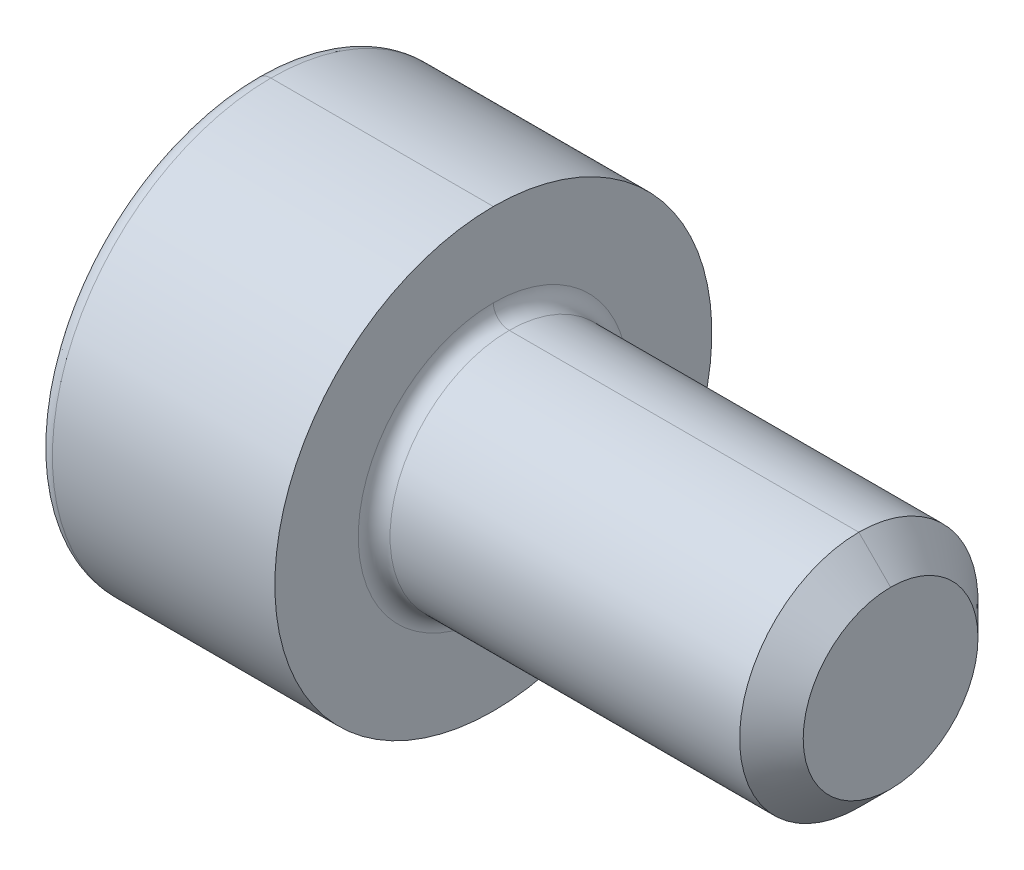
ISO-10303-21;
HEADER;
FILE_DESCRIPTION(('STEP AP214'),'2;1');
FILE_NAME('part.step','',(''),(''),'','','');
FILE_SCHEMA(('AUTOMOTIVE_DESIGN { 1 0 10303 214 1 1 1 1 }'));
ENDSEC;
DATA;
#1=APPLICATION_CONTEXT('core data for automotive mechanical design processes');
#2=APPLICATION_PROTOCOL_DEFINITION('international standard','automotive_design',2000,#1);
#3=PRODUCT_CONTEXT('',#1,'mechanical');
#4=PRODUCT('Part','Part','',(#3));
#5=PRODUCT_RELATED_PRODUCT_CATEGORY('part','',(#4));
#6=PRODUCT_DEFINITION_FORMATION('','',#4);
#7=PRODUCT_DEFINITION_CONTEXT('part definition',#1,'design');
#8=PRODUCT_DEFINITION('design','',#6,#7);
#9=PRODUCT_DEFINITION_SHAPE('','',#8);
#10=(LENGTH_UNIT() NAMED_UNIT(*) SI_UNIT(.MILLI.,.METRE.));
#11=(NAMED_UNIT(*) PLANE_ANGLE_UNIT() SI_UNIT($,.RADIAN.));
#12=(NAMED_UNIT(*) SI_UNIT($,.STERADIAN.) SOLID_ANGLE_UNIT());
#13=UNCERTAINTY_MEASURE_WITH_UNIT(LENGTH_MEASURE(1.E-05),#10,'distance_accuracy_value','');
#14=(GEOMETRIC_REPRESENTATION_CONTEXT(3) GLOBAL_UNCERTAINTY_ASSIGNED_CONTEXT((#13)) GLOBAL_UNIT_ASSIGNED_CONTEXT((#10,
#11,#12)) REPRESENTATION_CONTEXT('',''));
#15=CARTESIAN_POINT('',(0.,0.,0.));
#16=DIRECTION('',(0.,0.,1.));
#17=DIRECTION('',(1.,0.,0.));
#18=AXIS2_PLACEMENT_3D('',#15,#16,#17);
#19=CARTESIAN_POINT('',(1.5,0.,0.));
#20=DIRECTION('',(-1.,0.,0.));
#21=DIRECTION('',(0.,1.,0.));
#22=AXIS2_PLACEMENT_3D('',#19,#20,#21);
#23=PLANE('',#22);
#24=DIRECTION('',(0.,-0.866025403784438,0.5));
#25=VECTOR('',#24,1.);
#26=CARTESIAN_POINT('',(1.5,0.,-1.44337567297406));
#27=LINE('',#26,#25);
#28=CARTESIAN_POINT('',(1.5,0.,-1.44337567297406));
#29=VERTEX_POINT('',#28);
#30=CARTESIAN_POINT('',(1.5,-1.25,-0.721687836487032));
#31=VERTEX_POINT('',#30);
#32=EDGE_CURVE('E240',#29,#31,#27,.T.);
#33=ORIENTED_EDGE('',*,*,#32,.T.);
#34=DIRECTION('',(0.,0.,1.));
#35=VECTOR('',#34,1.);
#36=CARTESIAN_POINT('',(1.5,-1.25,-0.721687836487032));
#37=LINE('',#36,#35);
#38=CARTESIAN_POINT('',(1.5,-1.25,0.721687836487032));
#39=VERTEX_POINT('',#38);
#40=EDGE_CURVE('E11',#31,#39,#37,.T.);
#41=ORIENTED_EDGE('',*,*,#40,.T.);
#42=DIRECTION('',(0.,0.866025403784439,0.5));
#43=VECTOR('',#42,1.);
#44=CARTESIAN_POINT('',(1.5,-1.25,0.721687836487032));
#45=LINE('',#44,#43);
#46=CARTESIAN_POINT('',(1.5,0.,1.44337567297406));
#47=VERTEX_POINT('',#46);
#48=EDGE_CURVE('E43',#39,#47,#45,.T.);
#49=ORIENTED_EDGE('',*,*,#48,.T.);
#50=DIRECTION('',(0.,0.866025403784438,-0.5));
#51=VECTOR('',#50,1.);
#52=CARTESIAN_POINT('',(1.5,0.,1.44337567297406));
#53=LINE('',#52,#51);
#54=CARTESIAN_POINT('',(1.5,1.25,0.721687836487032));
#55=VERTEX_POINT('',#54);
#56=EDGE_CURVE('E262',#47,#55,#53,.T.);
#57=ORIENTED_EDGE('',*,*,#56,.T.);
#58=DIRECTION('',(0.,0.,-1.));
#59=VECTOR('',#58,1.);
#60=CARTESIAN_POINT('',(1.5,1.25,0.721687836487032));
#61=LINE('',#60,#59);
#62=CARTESIAN_POINT('',(1.5,1.25,-0.721687836487032));
#63=VERTEX_POINT('',#62);
#64=EDGE_CURVE('E229',#55,#63,#61,.T.);
#65=ORIENTED_EDGE('',*,*,#64,.T.);
#66=DIRECTION('',(0.,-0.866025403784439,-0.5));
#67=VECTOR('',#66,1.);
#68=CARTESIAN_POINT('',(1.5,1.25,-0.721687836487032));
#69=LINE('',#68,#67);
#70=EDGE_CURVE('E255',#63,#29,#69,.T.);
#71=ORIENTED_EDGE('',*,*,#70,.T.);
#72=EDGE_LOOP('',(#33,#41,#49,#57,#65,#71));
#73=FACE_BOUND('',#72,.T.);
#74=ADVANCED_FACE('F16',(#73),#23,.T.);
#75=CARTESIAN_POINT('',(1.5,-1.25,-0.721687836487032));
#76=DIRECTION('',(0.,-1.,0.));
#77=DIRECTION('',(0.,0.,-1.));
#78=AXIS2_PLACEMENT_3D('',#75,#76,#77);
#79=PLANE('',#78);
#80=DIRECTION('',(0.,0.,1.));
#81=VECTOR('',#80,1.);
#82=CARTESIAN_POINT('',(0.,-1.25,-0.721687836487032));
#83=LINE('',#82,#81);
#84=CARTESIAN_POINT('',(0.,-1.25,-0.721687836487032));
#85=VERTEX_POINT('',#84);
#86=CARTESIAN_POINT('',(0.,-1.25,0.721687836487032));
#87=VERTEX_POINT('',#86);
#88=EDGE_CURVE('E224',#85,#87,#83,.T.);
#89=ORIENTED_EDGE('',*,*,#88,.T.);
#90=DIRECTION('',(-1.,0.,0.));
#91=VECTOR('',#90,1.);
#92=CARTESIAN_POINT('',(1.5,-1.25,0.721687836487032));
#93=LINE('',#92,#91);
#94=EDGE_CURVE('E24',#39,#87,#93,.T.);
#95=ORIENTED_EDGE('',*,*,#94,.F.);
#96=ORIENTED_EDGE('',*,*,#40,.F.);
#97=DIRECTION('',(-1.,0.,0.));
#98=VECTOR('',#97,1.);
#99=CARTESIAN_POINT('',(1.5,-1.25,-0.721687836487032));
#100=LINE('',#99,#98);
#101=EDGE_CURVE('E237',#31,#85,#100,.T.);
#102=ORIENTED_EDGE('',*,*,#101,.T.);
#103=EDGE_LOOP('',(#89,#95,#96,#102));
#104=FACE_BOUND('',#103,.T.);
#105=ADVANCED_FACE('F278',(#104),#79,.F.);
#106=CARTESIAN_POINT('',(1.5,-1.25,0.721687836487032));
#107=DIRECTION('',(0.,-0.5,0.866025403784439));
#108=DIRECTION('',(-1.,0.,0.));
#109=AXIS2_PLACEMENT_3D('',#106,#107,#108);
#110=PLANE('',#109);
#111=DIRECTION('',(0.,0.866025403784439,0.5));
#112=VECTOR('',#111,1.);
#113=CARTESIAN_POINT('',(0.,-1.25,0.721687836487032));
#114=LINE('',#113,#112);
#115=CARTESIAN_POINT('',(0.,0.,1.44337567297406));
#116=VERTEX_POINT('',#115);
#117=EDGE_CURVE('E220',#87,#116,#114,.T.);
#118=ORIENTED_EDGE('',*,*,#117,.T.);
#119=DIRECTION('',(-1.,0.,0.));
#120=VECTOR('',#119,1.);
#121=CARTESIAN_POINT('',(1.5,0.,1.44337567297406));
#122=LINE('',#121,#120);
#123=EDGE_CURVE('E265',#47,#116,#122,.T.);
#124=ORIENTED_EDGE('',*,*,#123,.F.);
#125=ORIENTED_EDGE('',*,*,#48,.F.);
#126=ORIENTED_EDGE('',*,*,#94,.T.);
#127=EDGE_LOOP('',(#118,#124,#125,#126));
#128=FACE_BOUND('',#127,.T.);
#129=ADVANCED_FACE('F273',(#128),#110,.F.);
#130=CARTESIAN_POINT('',(1.5,0.,1.44337567297406));
#131=DIRECTION('',(0.,0.5,0.866025403784438));
#132=DIRECTION('',(1.,0.,0.));
#133=AXIS2_PLACEMENT_3D('',#130,#131,#132);
#134=PLANE('',#133);
#135=DIRECTION('',(0.,0.866025403784438,-0.5));
#136=VECTOR('',#135,1.);
#137=CARTESIAN_POINT('',(0.,0.,1.44337567297406));
#138=LINE('',#137,#136);
#139=CARTESIAN_POINT('',(0.,1.25,0.721687836487032));
#140=VERTEX_POINT('',#139);
#141=EDGE_CURVE('E216',#116,#140,#138,.T.);
#142=ORIENTED_EDGE('',*,*,#141,.T.);
#143=DIRECTION('',(-1.,0.,0.));
#144=VECTOR('',#143,1.);
#145=CARTESIAN_POINT('',(1.5,1.25,0.721687836487032));
#146=LINE('',#145,#144);
#147=EDGE_CURVE('E232',#55,#140,#146,.T.);
#148=ORIENTED_EDGE('',*,*,#147,.F.);
#149=ORIENTED_EDGE('',*,*,#56,.F.);
#150=ORIENTED_EDGE('',*,*,#123,.T.);
#151=EDGE_LOOP('',(#142,#148,#149,#150));
#152=FACE_BOUND('',#151,.T.);
#153=ADVANCED_FACE('F288',(#152),#134,.F.);
#154=CARTESIAN_POINT('',(1.5,1.25,0.721687836487032));
#155=DIRECTION('',(0.,1.,0.));
#156=DIRECTION('',(1.,0.,0.));
#157=AXIS2_PLACEMENT_3D('',#154,#155,#156);
#158=PLANE('',#157);
#159=DIRECTION('',(0.,0.,-1.));
#160=VECTOR('',#159,1.);
#161=CARTESIAN_POINT('',(0.,1.25,0.721687836487032));
#162=LINE('',#161,#160);
#163=CARTESIAN_POINT('',(0.,1.25,-0.721687836487032));
#164=VERTEX_POINT('',#163);
#165=EDGE_CURVE('E212',#140,#164,#162,.T.);
#166=ORIENTED_EDGE('',*,*,#165,.T.);
#167=DIRECTION('',(-1.,0.,0.));
#168=VECTOR('',#167,1.);
#169=CARTESIAN_POINT('',(1.5,1.25,-0.721687836487032));
#170=LINE('',#169,#168);
#171=EDGE_CURVE('E233',#63,#164,#170,.T.);
#172=ORIENTED_EDGE('',*,*,#171,.F.);
#173=ORIENTED_EDGE('',*,*,#64,.F.);
#174=ORIENTED_EDGE('',*,*,#147,.T.);
#175=EDGE_LOOP('',(#166,#172,#173,#174));
#176=FACE_BOUND('',#175,.T.);
#177=ADVANCED_FACE('F295',(#176),#158,.F.);
#178=CARTESIAN_POINT('',(1.5,1.25,-0.721687836487032));
#179=DIRECTION('',(0.,0.5,-0.866025403784439));
#180=DIRECTION('',(-1.,0.,0.));
#181=AXIS2_PLACEMENT_3D('',#178,#179,#180);
#182=PLANE('',#181);
#183=DIRECTION('',(0.,-0.866025403784439,-0.5));
#184=VECTOR('',#183,1.);
#185=CARTESIAN_POINT('',(0.,1.25,-0.721687836487032));
#186=LINE('',#185,#184);
#187=CARTESIAN_POINT('',(0.,0.,-1.44337567297406));
#188=VERTEX_POINT('',#187);
#189=EDGE_CURVE('E208',#164,#188,#186,.T.);
#190=ORIENTED_EDGE('',*,*,#189,.T.);
#191=DIRECTION('',(-1.,0.,0.));
#192=VECTOR('',#191,1.);
#193=CARTESIAN_POINT('',(1.5,0.,-1.44337567297406));
#194=LINE('',#193,#192);
#195=EDGE_CURVE('E252',#29,#188,#194,.T.);
#196=ORIENTED_EDGE('',*,*,#195,.F.);
#197=ORIENTED_EDGE('',*,*,#70,.F.);
#198=ORIENTED_EDGE('',*,*,#171,.T.);
#199=EDGE_LOOP('',(#190,#196,#197,#198));
#200=FACE_BOUND('',#199,.T.);
#201=ADVANCED_FACE('F297',(#200),#182,.F.);
#202=CARTESIAN_POINT('',(1.5,0.,-1.44337567297406));
#203=DIRECTION('',(0.,-0.5,-0.866025403784438));
#204=DIRECTION('',(0.,-0.866025403784438,0.5));
#205=AXIS2_PLACEMENT_3D('',#202,#203,#204);
#206=PLANE('',#205);
#207=DIRECTION('',(0.,-0.866025403784438,0.5));
#208=VECTOR('',#207,1.);
#209=CARTESIAN_POINT('',(0.,0.,-1.44337567297406));
#210=LINE('',#209,#208);
#211=EDGE_CURVE('E204',#188,#85,#210,.T.);
#212=ORIENTED_EDGE('',*,*,#211,.T.);
#213=ORIENTED_EDGE('',*,*,#101,.F.);
#214=ORIENTED_EDGE('',*,*,#32,.F.);
#215=ORIENTED_EDGE('',*,*,#195,.T.);
#216=EDGE_LOOP('',(#212,#213,#214,#215));
#217=FACE_BOUND('',#216,.T.);
#218=ADVANCED_FACE('F300',(#217),#206,.F.);
#219=CARTESIAN_POINT('',(8.,1.1,0.));
#220=DIRECTION('',(1.,0.,0.));
#221=DIRECTION('',(0.,-1.,0.));
#222=AXIS2_PLACEMENT_3D('',#219,#220,#221);
#223=PLANE('',#222);
#224=CARTESIAN_POINT('',(8.,0.,0.));
#225=DIRECTION('',(1.,0.,0.));
#226=DIRECTION('',(0.,1.,0.));
#227=AXIS2_PLACEMENT_3D('',#224,#225,#226);
#228=CIRCLE('',#227,1.1);
#229=CARTESIAN_POINT('',(8.,-1.1,0.));
#230=VERTEX_POINT('',#229);
#231=CARTESIAN_POINT('',(8.,1.1,0.));
#232=VERTEX_POINT('',#231);
#233=EDGE_CURVE('E241',#230,#232,#228,.T.);
#234=ORIENTED_EDGE('',*,*,#233,.T.);
#235=CARTESIAN_POINT('',(8.,0.,0.));
#236=DIRECTION('',(1.,0.,0.));
#237=DIRECTION('',(0.,1.,0.));
#238=AXIS2_PLACEMENT_3D('',#235,#236,#237);
#239=CIRCLE('',#238,1.1);
#240=EDGE_CURVE('E387',#232,#230,#239,.T.);
#241=ORIENTED_EDGE('',*,*,#240,.T.);
#242=EDGE_LOOP('',(#234,#241));
#243=FACE_BOUND('',#242,.T.);
#244=ADVANCED_FACE('F302',(#243),#223,.T.);
#245=CARTESIAN_POINT('',(8.,0.,0.));
#246=DIRECTION('',(-1.,0.,0.));
#247=DIRECTION('',(0.,-1.,0.));
#248=AXIS2_PLACEMENT_3D('',#245,#246,#247);
#249=CONICAL_SURFACE('',#248,1.1,0.785398163397447);
#250=DIRECTION('',(-0.707106781186548,0.707106781186547,0.));
#251=VECTOR('',#250,1.);
#252=CARTESIAN_POINT('',(8.,1.1,0.));
#253=LINE('',#252,#251);
#254=CARTESIAN_POINT('',(7.6,1.5,0.));
#255=VERTEX_POINT('',#254);
#256=EDGE_CURVE('E388',#232,#255,#253,.T.);
#257=ORIENTED_EDGE('',*,*,#256,.F.);
#258=ORIENTED_EDGE('',*,*,#233,.F.);
#259=DIRECTION('',(-0.707106781186549,-0.707106781186546,0.));
#260=VECTOR('',#259,1.);
#261=CARTESIAN_POINT('',(8.,-1.1,0.));
#262=LINE('',#261,#260);
#263=CARTESIAN_POINT('',(7.6,-1.5,0.));
#264=VERTEX_POINT('',#263);
#265=EDGE_CURVE('E178',#230,#264,#262,.T.);
#266=ORIENTED_EDGE('',*,*,#265,.T.);
#267=CARTESIAN_POINT('',(7.6,0.,0.));
#268=DIRECTION('',(1.,0.,0.));
#269=DIRECTION('',(0.,1.,0.));
#270=AXIS2_PLACEMENT_3D('',#267,#268,#269);
#271=CIRCLE('',#270,1.5);
#272=EDGE_CURVE('E170',#264,#255,#271,.T.);
#273=ORIENTED_EDGE('',*,*,#272,.T.);
#274=EDGE_LOOP('',(#257,#258,#266,#273));
#275=FACE_BOUND('',#274,.T.);
#276=ADVANCED_FACE('F310',(#275),#249,.T.);
#277=CARTESIAN_POINT('',(8.,0.,0.));
#278=DIRECTION('',(1.,0.,0.));
#279=DIRECTION('',(0.,1.,0.));
#280=AXIS2_PLACEMENT_3D('',#277,#278,#279);
#281=CYLINDRICAL_SURFACE('',#280,1.5);
#282=DIRECTION('',(1.,0.,0.));
#283=VECTOR('',#282,1.);
#284=CARTESIAN_POINT('',(8.,-1.5,0.));
#285=LINE('',#284,#283);
#286=CARTESIAN_POINT('',(3.2,-1.5,0.));
#287=VERTEX_POINT('',#286);
#288=EDGE_CURVE('E168',#287,#264,#285,.T.);
#289=ORIENTED_EDGE('',*,*,#288,.F.);
#290=CARTESIAN_POINT('',(3.2,0.,0.));
#291=DIRECTION('',(1.,0.,0.));
#292=DIRECTION('',(0.,1.,0.));
#293=AXIS2_PLACEMENT_3D('',#290,#291,#292);
#294=CIRCLE('',#293,1.5);
#295=CARTESIAN_POINT('',(3.2,1.5,0.));
#296=VERTEX_POINT('',#295);
#297=EDGE_CURVE('E155',#287,#296,#294,.T.);
#298=ORIENTED_EDGE('',*,*,#297,.T.);
#299=DIRECTION('',(1.,0.,0.));
#300=VECTOR('',#299,1.);
#301=CARTESIAN_POINT('',(8.,1.5,0.));
#302=LINE('',#301,#300);
#303=EDGE_CURVE('E165',#296,#255,#302,.T.);
#304=ORIENTED_EDGE('',*,*,#303,.T.);
#305=ORIENTED_EDGE('',*,*,#272,.F.);
#306=EDGE_LOOP('',(#289,#298,#304,#305));
#307=FACE_BOUND('',#306,.T.);
#308=ADVANCED_FACE('F169',(#307),#281,.T.);
#309=CARTESIAN_POINT('',(3.2,0.,0.));
#310=DIRECTION('',(1.,0.,0.));
#311=DIRECTION('',(0.,1.,0.));
#312=AXIS2_PLACEMENT_3D('',#309,#310,#311);
#313=TOROIDAL_SURFACE('',#312,1.7,0.2);
#314=CARTESIAN_POINT('',(3.2,-1.7,0.));
#315=DIRECTION('',(0.,0.,1.));
#316=DIRECTION('',(0.,-1.,0.));
#317=AXIS2_PLACEMENT_3D('',#314,#315,#316);
#318=CIRCLE('',#317,0.2);
#319=CARTESIAN_POINT('',(3.,-1.7,0.));
#320=VERTEX_POINT('',#319);
#321=EDGE_CURVE('E143',#287,#320,#318,.T.);
#322=ORIENTED_EDGE('',*,*,#321,.F.);
#323=CARTESIAN_POINT('',(3.2,0.,0.));
#324=DIRECTION('',(1.,0.,0.));
#325=DIRECTION('',(0.,1.,0.));
#326=AXIS2_PLACEMENT_3D('',#323,#324,#325);
#327=CIRCLE('',#326,1.5);
#328=EDGE_CURVE('E148',#296,#287,#327,.T.);
#329=ORIENTED_EDGE('',*,*,#328,.F.);
#330=CARTESIAN_POINT('',(3.2,1.7,0.));
#331=DIRECTION('',(0.,0.,-1.));
#332=DIRECTION('',(-1.,0.,0.));
#333=AXIS2_PLACEMENT_3D('',#330,#331,#332);
#334=CIRCLE('',#333,0.2);
#335=CARTESIAN_POINT('',(3.,1.7,0.));
#336=VERTEX_POINT('',#335);
#337=EDGE_CURVE('E160',#296,#336,#334,.T.);
#338=ORIENTED_EDGE('',*,*,#337,.T.);
#339=CARTESIAN_POINT('',(3.,0.,0.));
#340=DIRECTION('',(1.,0.,0.));
#341=DIRECTION('',(0.,1.,0.));
#342=AXIS2_PLACEMENT_3D('',#339,#340,#341);
#343=CIRCLE('',#342,1.7);
#344=EDGE_CURVE('E149',#336,#320,#343,.T.);
#345=ORIENTED_EDGE('',*,*,#344,.T.);
#346=EDGE_LOOP('',(#322,#329,#338,#345));
#347=FACE_BOUND('',#346,.T.);
#348=ADVANCED_FACE('F145',(#347),#313,.F.);
#349=CARTESIAN_POINT('',(3.,2.75,0.));
#350=DIRECTION('',(1.,0.,0.));
#351=DIRECTION('',(0.,-1.,0.));
#352=AXIS2_PLACEMENT_3D('',#349,#350,#351);
#353=PLANE('',#352);
#354=ORIENTED_EDGE('',*,*,#344,.F.);
#355=CARTESIAN_POINT('',(3.,0.,0.));
#356=DIRECTION('',(1.,0.,0.));
#357=DIRECTION('',(0.,1.,0.));
#358=AXIS2_PLACEMENT_3D('',#355,#356,#357);
#359=CIRCLE('',#358,1.7);
#360=EDGE_CURVE('E154',#320,#336,#359,.T.);
#361=ORIENTED_EDGE('',*,*,#360,.F.);
#362=EDGE_LOOP('',(#354,#361));
#363=FACE_BOUND('',#362,.T.);
#364=CARTESIAN_POINT('',(3.,0.,0.));
#365=DIRECTION('',(1.,0.,0.));
#366=DIRECTION('',(0.,1.,0.));
#367=AXIS2_PLACEMENT_3D('',#364,#365,#366);
#368=CIRCLE('',#367,2.75);
#369=CARTESIAN_POINT('',(3.,2.75,0.));
#370=VERTEX_POINT('',#369);
#371=CARTESIAN_POINT('',(3.,-2.75,0.));
#372=VERTEX_POINT('',#371);
#373=EDGE_CURVE('E377',#370,#372,#368,.T.);
#374=ORIENTED_EDGE('',*,*,#373,.T.);
#375=CARTESIAN_POINT('',(3.,0.,0.));
#376=DIRECTION('',(1.,0.,0.));
#377=DIRECTION('',(0.,1.,0.));
#378=AXIS2_PLACEMENT_3D('',#375,#376,#377);
#379=CIRCLE('',#378,2.75);
#380=EDGE_CURVE('E236',#372,#370,#379,.T.);
#381=ORIENTED_EDGE('',*,*,#380,.T.);
#382=EDGE_LOOP('',(#374,#381));
#383=FACE_BOUND('',#382,.T.);
#384=ADVANCED_FACE('F337',(#363,#383),#353,.T.);
#385=CARTESIAN_POINT('',(8.,0.,0.));
#386=DIRECTION('',(1.,0.,0.));
#387=DIRECTION('',(0.,1.,0.));
#388=AXIS2_PLACEMENT_3D('',#385,#386,#387);
#389=CYLINDRICAL_SURFACE('',#388,2.75);
#390=DIRECTION('',(1.,0.,0.));
#391=VECTOR('',#390,1.);
#392=CARTESIAN_POINT('',(8.,-2.75,0.));
#393=LINE('',#392,#391);
#394=CARTESIAN_POINT('',(0.2,-2.75,0.));
#395=VERTEX_POINT('',#394);
#396=EDGE_CURVE('E198',#395,#372,#393,.T.);
#397=ORIENTED_EDGE('',*,*,#396,.F.);
#398=CARTESIAN_POINT('',(0.2,0.,0.));
#399=DIRECTION('',(1.,0.,0.));
#400=DIRECTION('',(0.,1.,0.));
#401=AXIS2_PLACEMENT_3D('',#398,#399,#400);
#402=CIRCLE('',#401,2.75);
#403=CARTESIAN_POINT('',(0.2,2.75,0.));
#404=VERTEX_POINT('',#403);
#405=EDGE_CURVE('E228',#395,#404,#402,.T.);
#406=ORIENTED_EDGE('',*,*,#405,.T.);
#407=DIRECTION('',(1.,0.,0.));
#408=VECTOR('',#407,1.);
#409=CARTESIAN_POINT('',(8.,2.75,0.));
#410=LINE('',#409,#408);
#411=EDGE_CURVE('E369',#404,#370,#410,.T.);
#412=ORIENTED_EDGE('',*,*,#411,.T.);
#413=ORIENTED_EDGE('',*,*,#380,.F.);
#414=EDGE_LOOP('',(#397,#406,#412,#413));
#415=FACE_BOUND('',#414,.T.);
#416=ADVANCED_FACE('F334',(#415),#389,.T.);
#417=CARTESIAN_POINT('',(0.2,0.,0.));
#418=DIRECTION('',(1.,0.,0.));
#419=DIRECTION('',(0.,1.,0.));
#420=AXIS2_PLACEMENT_3D('',#417,#418,#419);
#421=TOROIDAL_SURFACE('',#420,2.55,0.2);
#422=CARTESIAN_POINT('',(0.2,-2.55,0.));
#423=DIRECTION('',(0.,0.,1.));
#424=DIRECTION('',(0.,-1.,0.));
#425=AXIS2_PLACEMENT_3D('',#422,#423,#424);
#426=CIRCLE('',#425,0.2);
#427=CARTESIAN_POINT('',(0.,-2.55,0.));
#428=VERTEX_POINT('',#427);
#429=EDGE_CURVE('E189',#428,#395,#426,.T.);
#430=ORIENTED_EDGE('',*,*,#429,.F.);
#431=CARTESIAN_POINT('',(0.,0.,0.));
#432=DIRECTION('',(1.,0.,0.));
#433=DIRECTION('',(0.,1.,0.));
#434=AXIS2_PLACEMENT_3D('',#431,#432,#433);
#435=CIRCLE('',#434,2.55);
#436=CARTESIAN_POINT('',(0.,2.55,0.));
#437=VERTEX_POINT('',#436);
#438=EDGE_CURVE('E203',#428,#437,#435,.T.);
#439=ORIENTED_EDGE('',*,*,#438,.T.);
#440=CARTESIAN_POINT('',(0.2,2.55,0.));
#441=DIRECTION('',(0.,0.,-1.));
#442=DIRECTION('',(-1.,0.,0.));
#443=AXIS2_PLACEMENT_3D('',#440,#441,#442);
#444=CIRCLE('',#443,0.2);
#445=EDGE_CURVE('E199',#437,#404,#444,.T.);
#446=ORIENTED_EDGE('',*,*,#445,.T.);
#447=ORIENTED_EDGE('',*,*,#405,.F.);
#448=EDGE_LOOP('',(#430,#439,#446,#447));
#449=FACE_BOUND('',#448,.T.);
#450=ADVANCED_FACE('F336',(#449),#421,.T.);
#451=CARTESIAN_POINT('',(0.,0.,0.));
#452=DIRECTION('',(-1.,0.,0.));
#453=DIRECTION('',(0.,0.,1.));
#454=AXIS2_PLACEMENT_3D('',#451,#452,#453);
#455=PLANE('',#454);
#456=ORIENTED_EDGE('',*,*,#211,.F.);
#457=ORIENTED_EDGE('',*,*,#189,.F.);
#458=ORIENTED_EDGE('',*,*,#165,.F.);
#459=ORIENTED_EDGE('',*,*,#141,.F.);
#460=ORIENTED_EDGE('',*,*,#117,.F.);
#461=ORIENTED_EDGE('',*,*,#88,.F.);
#462=EDGE_LOOP('',(#456,#457,#458,#459,#460,#461));
#463=FACE_BOUND('',#462,.T.);
#464=CARTESIAN_POINT('',(0.,0.,0.));
#465=DIRECTION('',(1.,0.,0.));
#466=DIRECTION('',(0.,1.,0.));
#467=AXIS2_PLACEMENT_3D('',#464,#465,#466);
#468=CIRCLE('',#467,2.55);
#469=EDGE_CURVE('E374',#437,#428,#468,.T.);
#470=ORIENTED_EDGE('',*,*,#469,.F.);
#471=ORIENTED_EDGE('',*,*,#438,.F.);
#472=EDGE_LOOP('',(#470,#471));
#473=FACE_BOUND('',#472,.T.);
#474=ADVANCED_FACE('F282',(#463,#473),#455,.T.);
#475=CARTESIAN_POINT('',(0.2,0.,0.));
#476=DIRECTION('',(1.,0.,0.));
#477=DIRECTION('',(0.,1.,0.));
#478=AXIS2_PLACEMENT_3D('',#475,#476,#477);
#479=TOROIDAL_SURFACE('',#478,2.55,0.2);
#480=ORIENTED_EDGE('',*,*,#469,.T.);
#481=ORIENTED_EDGE('',*,*,#429,.T.);
#482=CARTESIAN_POINT('',(0.2,0.,0.));
#483=DIRECTION('',(1.,0.,0.));
#484=DIRECTION('',(0.,1.,0.));
#485=AXIS2_PLACEMENT_3D('',#482,#483,#484);
#486=CIRCLE('',#485,2.75);
#487=EDGE_CURVE('E194',#404,#395,#486,.T.);
#488=ORIENTED_EDGE('',*,*,#487,.F.);
#489=ORIENTED_EDGE('',*,*,#445,.F.);
#490=EDGE_LOOP('',(#480,#481,#488,#489));
#491=FACE_BOUND('',#490,.T.);
#492=ADVANCED_FACE('F340',(#491),#479,.T.);
#493=CARTESIAN_POINT('',(8.,0.,0.));
#494=DIRECTION('',(1.,0.,0.));
#495=DIRECTION('',(0.,1.,0.));
#496=AXIS2_PLACEMENT_3D('',#493,#494,#495);
#497=CYLINDRICAL_SURFACE('',#496,2.75);
#498=ORIENTED_EDGE('',*,*,#487,.T.);
#499=ORIENTED_EDGE('',*,*,#396,.T.);
#500=ORIENTED_EDGE('',*,*,#373,.F.);
#501=ORIENTED_EDGE('',*,*,#411,.F.);
#502=EDGE_LOOP('',(#498,#499,#500,#501));
#503=FACE_BOUND('',#502,.T.);
#504=ADVANCED_FACE('F342',(#503),#497,.T.);
#505=CARTESIAN_POINT('',(3.2,0.,0.));
#506=DIRECTION('',(1.,0.,0.));
#507=DIRECTION('',(0.,1.,0.));
#508=AXIS2_PLACEMENT_3D('',#505,#506,#507);
#509=TOROIDAL_SURFACE('',#508,1.7,0.2);
#510=ORIENTED_EDGE('',*,*,#297,.F.);
#511=ORIENTED_EDGE('',*,*,#321,.T.);
#512=ORIENTED_EDGE('',*,*,#360,.T.);
#513=ORIENTED_EDGE('',*,*,#337,.F.);
#514=EDGE_LOOP('',(#510,#511,#512,#513));
#515=FACE_BOUND('',#514,.T.);
#516=ADVANCED_FACE('F159',(#515),#509,.F.);
#517=CARTESIAN_POINT('',(8.,0.,0.));
#518=DIRECTION('',(1.,0.,0.));
#519=DIRECTION('',(0.,1.,0.));
#520=AXIS2_PLACEMENT_3D('',#517,#518,#519);
#521=CYLINDRICAL_SURFACE('',#520,1.5);
#522=ORIENTED_EDGE('',*,*,#328,.T.);
#523=ORIENTED_EDGE('',*,*,#288,.T.);
#524=CARTESIAN_POINT('',(7.6,0.,0.));
#525=DIRECTION('',(1.,0.,0.));
#526=DIRECTION('',(0.,1.,0.));
#527=AXIS2_PLACEMENT_3D('',#524,#525,#526);
#528=CIRCLE('',#527,1.5);
#529=EDGE_CURVE('E185',#255,#264,#528,.T.);
#530=ORIENTED_EDGE('',*,*,#529,.F.);
#531=ORIENTED_EDGE('',*,*,#303,.F.);
#532=EDGE_LOOP('',(#522,#523,#530,#531));
#533=FACE_BOUND('',#532,.T.);
#534=ADVANCED_FACE('F176',(#533),#521,.T.);
#535=CARTESIAN_POINT('',(8.,0.,0.));
#536=DIRECTION('',(-1.,0.,0.));
#537=DIRECTION('',(0.,-1.,0.));
#538=AXIS2_PLACEMENT_3D('',#535,#536,#537);
#539=CONICAL_SURFACE('',#538,1.1,0.785398163397447);
#540=ORIENTED_EDGE('',*,*,#240,.F.);
#541=ORIENTED_EDGE('',*,*,#256,.T.);
#542=ORIENTED_EDGE('',*,*,#529,.T.);
#543=ORIENTED_EDGE('',*,*,#265,.F.);
#544=EDGE_LOOP('',(#540,#541,#542,#543));
#545=FACE_BOUND('',#544,.T.);
#546=ADVANCED_FACE('F501',(#545),#539,.T.);
#547=CLOSED_SHELL('',(#74,#105,#129,#153,#177,#201,#218,#244,#276,#308,#348,#384,#416,#450,#474,
#492,#504,#516,#534,#546));
#548=MANIFOLD_SOLID_BREP('B1',#547);
#549=ADVANCED_BREP_SHAPE_REPRESENTATION('',(#18,#548),#14);
#550=SHAPE_DEFINITION_REPRESENTATION(#9,#549);
ENDSEC;
END-ISO-10303-21;
